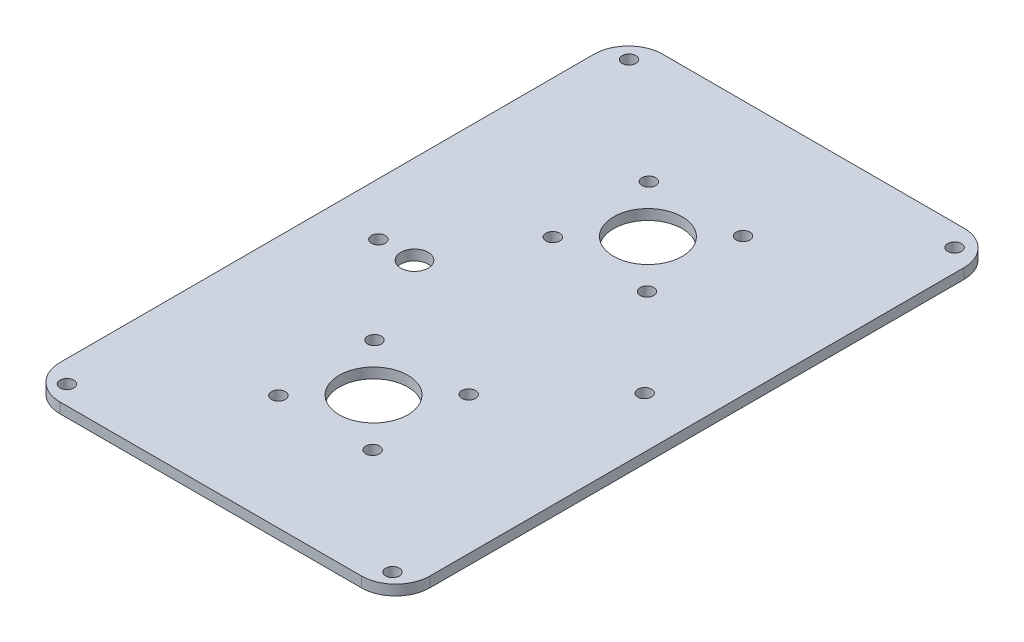
ISO-10303-21;
HEADER;
FILE_DESCRIPTION(('STEP AP214'),'2;1');
FILE_NAME('part.step','',(''),(''),'','','');
FILE_SCHEMA(('AUTOMOTIVE_DESIGN { 1 0 10303 214 1 1 1 1 }'));
ENDSEC;
DATA;
#1=APPLICATION_CONTEXT('core data for automotive mechanical design processes');
#2=APPLICATION_PROTOCOL_DEFINITION('international standard','automotive_design',2000,#1);
#3=PRODUCT_CONTEXT('',#1,'mechanical');
#4=PRODUCT('Part','Part','',(#3));
#5=PRODUCT_RELATED_PRODUCT_CATEGORY('part','',(#4));
#6=PRODUCT_DEFINITION_FORMATION('','',#4);
#7=PRODUCT_DEFINITION_CONTEXT('part definition',#1,'design');
#8=PRODUCT_DEFINITION('design','',#6,#7);
#9=PRODUCT_DEFINITION_SHAPE('','',#8);
#10=(LENGTH_UNIT() NAMED_UNIT(*) SI_UNIT(.MILLI.,.METRE.));
#11=(NAMED_UNIT(*) PLANE_ANGLE_UNIT() SI_UNIT($,.RADIAN.));
#12=(NAMED_UNIT(*) SI_UNIT($,.STERADIAN.) SOLID_ANGLE_UNIT());
#13=UNCERTAINTY_MEASURE_WITH_UNIT(LENGTH_MEASURE(1.E-05),#10,'distance_accuracy_value','');
#14=(GEOMETRIC_REPRESENTATION_CONTEXT(3) GLOBAL_UNCERTAINTY_ASSIGNED_CONTEXT((#13)) GLOBAL_UNIT_ASSIGNED_CONTEXT((#10,
#11,#12)) REPRESENTATION_CONTEXT('',''));
#15=CARTESIAN_POINT('',(0.,0.,0.));
#16=DIRECTION('',(0.,0.,1.));
#17=DIRECTION('',(1.,0.,0.));
#18=AXIS2_PLACEMENT_3D('',#15,#16,#17);
#19=CARTESIAN_POINT('',(-18.9149999999999,3.,-78.1963078680093));
#20=DIRECTION('',(0.,-1.,0.));
#21=DIRECTION('',(0.,0.,-1.));
#22=AXIS2_PLACEMENT_3D('',#19,#20,#21);
#23=CYLINDRICAL_SURFACE('',#22,9.99999999999999);
#24=CARTESIAN_POINT('',(-18.9149999999999,0.,-78.1963078680093));
#25=DIRECTION('',(0.,1.,0.));
#26=DIRECTION('',(0.,0.,1.));
#27=AXIS2_PLACEMENT_3D('',#24,#25,#26);
#28=CIRCLE('',#27,9.99999999999999);
#29=CARTESIAN_POINT('',(-28.9149999999999,0.,-78.1963078680093));
#30=VERTEX_POINT('',#29);
#31=CARTESIAN_POINT('',(-18.9149999999999,0.,-88.1963078680093));
#32=VERTEX_POINT('',#31);
#33=EDGE_CURVE('E186',#30,#32,#28,.F.);
#34=ORIENTED_EDGE('',*,*,#33,.F.);
#35=DIRECTION('',(0.,-1.,0.));
#36=VECTOR('',#35,1.);
#37=CARTESIAN_POINT('',(-28.9149999999999,3.,-78.1963078680093));
#38=LINE('',#37,#36);
#39=CARTESIAN_POINT('',(-28.9149999999999,3.,-78.1963078680093));
#40=VERTEX_POINT('',#39);
#41=EDGE_CURVE('E11',#40,#30,#38,.T.);
#42=ORIENTED_EDGE('',*,*,#41,.F.);
#43=CARTESIAN_POINT('',(-18.9149999999999,3.,-78.1963078680093));
#44=DIRECTION('',(0.,1.,0.));
#45=DIRECTION('',(0.,0.,1.));
#46=AXIS2_PLACEMENT_3D('',#43,#44,#45);
#47=CIRCLE('',#46,9.99999999999999);
#48=CARTESIAN_POINT('',(-18.9149999999999,3.,-88.1963078680093));
#49=VERTEX_POINT('',#48);
#50=EDGE_CURVE('E254',#40,#49,#47,.F.);
#51=ORIENTED_EDGE('',*,*,#50,.T.);
#52=DIRECTION('',(0.,-1.,0.));
#53=VECTOR('',#52,1.);
#54=CARTESIAN_POINT('',(-18.9149999999999,3.,-88.1963078680093));
#55=LINE('',#54,#53);
#56=EDGE_CURVE('E54',#49,#32,#55,.T.);
#57=ORIENTED_EDGE('',*,*,#56,.T.);
#58=EDGE_LOOP('',(#34,#42,#51,#57));
#59=FACE_BOUND('',#58,.T.);
#60=ADVANCED_FACE('F37',(#59),#23,.T.);
#61=CARTESIAN_POINT('',(-28.9149999999999,3.,0.));
#62=DIRECTION('',(1.,0.,0.));
#63=DIRECTION('',(0.,0.,-1.));
#64=AXIS2_PLACEMENT_3D('',#61,#62,#63);
#65=PLANE('',#64);
#66=DIRECTION('',(0.,0.,1.));
#67=VECTOR('',#66,1.);
#68=CARTESIAN_POINT('',(-28.9149999999999,0.,0.));
#69=LINE('',#68,#67);
#70=CARTESIAN_POINT('',(-28.9149999999999,0.,77.4636921319892));
#71=VERTEX_POINT('',#70);
#72=EDGE_CURVE('E188',#30,#71,#69,.T.);
#73=ORIENTED_EDGE('',*,*,#72,.T.);
#74=DIRECTION('',(0.,-1.,0.));
#75=VECTOR('',#74,1.);
#76=CARTESIAN_POINT('',(-28.9149999999999,3.,77.4636921319892));
#77=LINE('',#76,#75);
#78=CARTESIAN_POINT('',(-28.9149999999999,3.,77.4636921319892));
#79=VERTEX_POINT('',#78);
#80=EDGE_CURVE('E46',#79,#71,#77,.T.);
#81=ORIENTED_EDGE('',*,*,#80,.F.);
#82=DIRECTION('',(0.,0.,1.));
#83=VECTOR('',#82,1.);
#84=CARTESIAN_POINT('',(-28.9149999999999,3.,0.));
#85=LINE('',#84,#83);
#86=EDGE_CURVE('E252',#40,#79,#85,.T.);
#87=ORIENTED_EDGE('',*,*,#86,.F.);
#88=ORIENTED_EDGE('',*,*,#41,.T.);
#89=EDGE_LOOP('',(#73,#81,#87,#88));
#90=FACE_BOUND('',#89,.T.);
#91=ADVANCED_FACE('F243',(#90),#65,.F.);
#92=CARTESIAN_POINT('',(-18.9149999999999,3.,77.4636921319892));
#93=DIRECTION('',(0.,-1.,0.));
#94=DIRECTION('',(0.,0.,-1.));
#95=AXIS2_PLACEMENT_3D('',#92,#93,#94);
#96=CYLINDRICAL_SURFACE('',#95,10.);
#97=CARTESIAN_POINT('',(-18.9149999999999,0.,77.4636921319892));
#98=DIRECTION('',(0.,1.,0.));
#99=DIRECTION('',(0.,0.,1.));
#100=AXIS2_PLACEMENT_3D('',#97,#98,#99);
#101=CIRCLE('',#100,10.);
#102=CARTESIAN_POINT('',(-18.9149999999999,0.,87.4636921319892));
#103=VERTEX_POINT('',#102);
#104=EDGE_CURVE('E191',#103,#71,#101,.F.);
#105=ORIENTED_EDGE('',*,*,#104,.F.);
#106=DIRECTION('',(0.,-1.,0.));
#107=VECTOR('',#106,1.);
#108=CARTESIAN_POINT('',(-18.9149999999999,3.,87.4636921319892));
#109=LINE('',#108,#107);
#110=CARTESIAN_POINT('',(-18.9149999999999,3.,87.4636921319892));
#111=VERTEX_POINT('',#110);
#112=EDGE_CURVE('E233',#111,#103,#109,.T.);
#113=ORIENTED_EDGE('',*,*,#112,.F.);
#114=CARTESIAN_POINT('',(-18.9149999999999,3.,77.4636921319892));
#115=DIRECTION('',(0.,1.,0.));
#116=DIRECTION('',(0.,0.,1.));
#117=AXIS2_PLACEMENT_3D('',#114,#115,#116);
#118=CIRCLE('',#117,10.);
#119=EDGE_CURVE('E240',#111,#79,#118,.F.);
#120=ORIENTED_EDGE('',*,*,#119,.T.);
#121=ORIENTED_EDGE('',*,*,#80,.T.);
#122=EDGE_LOOP('',(#105,#113,#120,#121));
#123=FACE_BOUND('',#122,.T.);
#124=ADVANCED_FACE('F238',(#123),#96,.T.);
#125=CARTESIAN_POINT('',(0.,3.,87.4636921319892));
#126=DIRECTION('',(0.,0.,1.));
#127=DIRECTION('',(1.,0.,0.));
#128=AXIS2_PLACEMENT_3D('',#125,#126,#127);
#129=PLANE('',#128);
#130=DIRECTION('',(-1.,0.,0.));
#131=VECTOR('',#130,1.);
#132=CARTESIAN_POINT('',(0.,0.,87.4636921319892));
#133=LINE('',#132,#131);
#134=CARTESIAN_POINT('',(68.9150000000001,0.,87.4636921319892));
#135=VERTEX_POINT('',#134);
#136=EDGE_CURVE('E194',#135,#103,#133,.T.);
#137=ORIENTED_EDGE('',*,*,#136,.F.);
#138=DIRECTION('',(0.,-1.,0.));
#139=VECTOR('',#138,1.);
#140=CARTESIAN_POINT('',(68.9150000000001,3.,87.4636921319892));
#141=LINE('',#140,#139);
#142=CARTESIAN_POINT('',(68.9150000000001,3.,87.4636921319892));
#143=VERTEX_POINT('',#142);
#144=EDGE_CURVE('E231',#143,#135,#141,.T.);
#145=ORIENTED_EDGE('',*,*,#144,.F.);
#146=DIRECTION('',(-1.,0.,0.));
#147=VECTOR('',#146,1.);
#148=CARTESIAN_POINT('',(0.,3.,87.4636921319892));
#149=LINE('',#148,#147);
#150=EDGE_CURVE('E130',#143,#111,#149,.T.);
#151=ORIENTED_EDGE('',*,*,#150,.T.);
#152=ORIENTED_EDGE('',*,*,#112,.T.);
#153=EDGE_LOOP('',(#137,#145,#151,#152));
#154=FACE_BOUND('',#153,.T.);
#155=ADVANCED_FACE('F250',(#154),#129,.T.);
#156=CARTESIAN_POINT('',(68.9150000000001,3.,77.4636921319892));
#157=DIRECTION('',(0.,-1.,0.));
#158=DIRECTION('',(0.,0.,-1.));
#159=AXIS2_PLACEMENT_3D('',#156,#157,#158);
#160=CYLINDRICAL_SURFACE('',#159,10.);
#161=CARTESIAN_POINT('',(68.9150000000001,0.,77.4636921319892));
#162=DIRECTION('',(0.,1.,0.));
#163=DIRECTION('',(0.,0.,1.));
#164=AXIS2_PLACEMENT_3D('',#161,#162,#163);
#165=CIRCLE('',#164,10.);
#166=CARTESIAN_POINT('',(78.9150000000001,0.,77.4636921319892));
#167=VERTEX_POINT('',#166);
#168=EDGE_CURVE('E197',#135,#167,#165,.T.);
#169=ORIENTED_EDGE('',*,*,#168,.T.);
#170=DIRECTION('',(0.,-1.,0.));
#171=VECTOR('',#170,1.);
#172=CARTESIAN_POINT('',(78.9150000000001,3.,77.4636921319892));
#173=LINE('',#172,#171);
#174=CARTESIAN_POINT('',(78.9150000000001,3.,77.4636921319892));
#175=VERTEX_POINT('',#174);
#176=EDGE_CURVE('E114',#175,#167,#173,.T.);
#177=ORIENTED_EDGE('',*,*,#176,.F.);
#178=CARTESIAN_POINT('',(68.9150000000001,3.,77.4636921319892));
#179=DIRECTION('',(0.,1.,0.));
#180=DIRECTION('',(0.,0.,1.));
#181=AXIS2_PLACEMENT_3D('',#178,#179,#180);
#182=CIRCLE('',#181,10.);
#183=EDGE_CURVE('E127',#143,#175,#182,.T.);
#184=ORIENTED_EDGE('',*,*,#183,.F.);
#185=ORIENTED_EDGE('',*,*,#144,.T.);
#186=EDGE_LOOP('',(#169,#177,#184,#185));
#187=FACE_BOUND('',#186,.T.);
#188=ADVANCED_FACE('F429',(#187),#160,.T.);
#189=CARTESIAN_POINT('',(78.9150000000001,3.,0.));
#190=DIRECTION('',(1.,0.,0.));
#191=DIRECTION('',(0.,0.,-1.));
#192=AXIS2_PLACEMENT_3D('',#189,#190,#191);
#193=PLANE('',#192);
#194=DIRECTION('',(0.,0.,1.));
#195=VECTOR('',#194,1.);
#196=CARTESIAN_POINT('',(78.9150000000001,0.,0.));
#197=LINE('',#196,#195);
#198=CARTESIAN_POINT('',(78.9150000000001,0.,-78.1963078680093));
#199=VERTEX_POINT('',#198);
#200=EDGE_CURVE('E111',#199,#167,#197,.T.);
#201=ORIENTED_EDGE('',*,*,#200,.F.);
#202=DIRECTION('',(0.,-1.,0.));
#203=VECTOR('',#202,1.);
#204=CARTESIAN_POINT('',(78.9150000000001,3.,-78.1963078680093));
#205=LINE('',#204,#203);
#206=CARTESIAN_POINT('',(78.9150000000001,3.,-78.1963078680093));
#207=VERTEX_POINT('',#206);
#208=EDGE_CURVE('E105',#207,#199,#205,.T.);
#209=ORIENTED_EDGE('',*,*,#208,.F.);
#210=DIRECTION('',(0.,0.,1.));
#211=VECTOR('',#210,1.);
#212=CARTESIAN_POINT('',(78.9150000000001,3.,0.));
#213=LINE('',#212,#211);
#214=EDGE_CURVE('E109',#207,#175,#213,.T.);
#215=ORIENTED_EDGE('',*,*,#214,.T.);
#216=ORIENTED_EDGE('',*,*,#176,.T.);
#217=EDGE_LOOP('',(#201,#209,#215,#216));
#218=FACE_BOUND('',#217,.T.);
#219=ADVANCED_FACE('F107',(#218),#193,.T.);
#220=CARTESIAN_POINT('',(68.9150000000001,3.,-78.1963078680093));
#221=DIRECTION('',(0.,-1.,0.));
#222=DIRECTION('',(0.,0.,-1.));
#223=AXIS2_PLACEMENT_3D('',#220,#221,#222);
#224=CYLINDRICAL_SURFACE('',#223,10.);
#225=CARTESIAN_POINT('',(68.9150000000001,0.,-78.1963078680093));
#226=DIRECTION('',(0.,1.,0.));
#227=DIRECTION('',(0.,0.,1.));
#228=AXIS2_PLACEMENT_3D('',#225,#226,#227);
#229=CIRCLE('',#228,10.);
#230=CARTESIAN_POINT('',(68.9150000000001,0.,-88.1963078680093));
#231=VERTEX_POINT('',#230);
#232=EDGE_CURVE('E201',#199,#231,#229,.T.);
#233=ORIENTED_EDGE('',*,*,#232,.T.);
#234=DIRECTION('',(0.,-1.,0.));
#235=VECTOR('',#234,1.);
#236=CARTESIAN_POINT('',(68.9150000000001,3.,-88.1963078680093));
#237=LINE('',#236,#235);
#238=CARTESIAN_POINT('',(68.9150000000001,3.,-88.1963078680093));
#239=VERTEX_POINT('',#238);
#240=EDGE_CURVE('E80',#239,#231,#237,.T.);
#241=ORIENTED_EDGE('',*,*,#240,.F.);
#242=CARTESIAN_POINT('',(68.9150000000001,3.,-78.1963078680093));
#243=DIRECTION('',(0.,1.,0.));
#244=DIRECTION('',(0.,0.,1.));
#245=AXIS2_PLACEMENT_3D('',#242,#243,#244);
#246=CIRCLE('',#245,10.);
#247=EDGE_CURVE('E116',#207,#239,#246,.T.);
#248=ORIENTED_EDGE('',*,*,#247,.F.);
#249=ORIENTED_EDGE('',*,*,#208,.T.);
#250=EDGE_LOOP('',(#233,#241,#248,#249));
#251=FACE_BOUND('',#250,.T.);
#252=ADVANCED_FACE('F117',(#251),#224,.T.);
#253=CARTESIAN_POINT('',(11.2670350896735,3.,-26.));
#254=DIRECTION('',(0.,-1.,0.));
#255=DIRECTION('',(0.,0.,-1.));
#256=AXIS2_PLACEMENT_3D('',#253,#254,#255);
#257=CYLINDRICAL_SURFACE('',#256,2.);
#258=CARTESIAN_POINT('',(11.2670350896735,3.,-26.));
#259=DIRECTION('',(0.,1.,0.));
#260=DIRECTION('',(0.,0.,1.));
#261=AXIS2_PLACEMENT_3D('',#258,#259,#260);
#262=CIRCLE('',#261,2.);
#263=CARTESIAN_POINT('',(11.2670350896735,3.,-24.));
#264=VERTEX_POINT('',#263);
#265=EDGE_CURVE('E150',#264,#264,#262,.F.);
#266=ORIENTED_EDGE('',*,*,#265,.F.);
#267=EDGE_LOOP('',(#266));
#268=FACE_BOUND('',#267,.T.);
#269=CARTESIAN_POINT('',(11.2670350896735,0.,-26.));
#270=DIRECTION('',(0.,1.,0.));
#271=DIRECTION('',(0.,0.,1.));
#272=AXIS2_PLACEMENT_3D('',#269,#270,#271);
#273=CIRCLE('',#272,2.);
#274=CARTESIAN_POINT('',(11.2670350896735,0.,-24.));
#275=VERTEX_POINT('',#274);
#276=EDGE_CURVE('E221',#275,#275,#273,.F.);
#277=ORIENTED_EDGE('',*,*,#276,.T.);
#278=EDGE_LOOP('',(#277));
#279=FACE_BOUND('',#278,.T.);
#280=ADVANCED_FACE('F399',(#268,#279),#257,.F.);
#281=CARTESIAN_POINT('',(38.7329649103267,3.,-26.));
#282=DIRECTION('',(0.,-1.,0.));
#283=DIRECTION('',(0.,0.,-1.));
#284=AXIS2_PLACEMENT_3D('',#281,#282,#283);
#285=CYLINDRICAL_SURFACE('',#284,2.);
#286=CARTESIAN_POINT('',(38.7329649103267,3.,-26.));
#287=DIRECTION('',(0.,1.,0.));
#288=DIRECTION('',(0.,0.,1.));
#289=AXIS2_PLACEMENT_3D('',#286,#287,#288);
#290=CIRCLE('',#289,2.);
#291=CARTESIAN_POINT('',(38.7329649103267,3.,-24.));
#292=VERTEX_POINT('',#291);
#293=EDGE_CURVE('E147',#292,#292,#290,.T.);
#294=ORIENTED_EDGE('',*,*,#293,.T.);
#295=EDGE_LOOP('',(#294));
#296=FACE_BOUND('',#295,.T.);
#297=CARTESIAN_POINT('',(38.7329649103267,0.,-26.));
#298=DIRECTION('',(0.,1.,0.));
#299=DIRECTION('',(0.,0.,1.));
#300=AXIS2_PLACEMENT_3D('',#297,#298,#299);
#301=CIRCLE('',#300,2.);
#302=CARTESIAN_POINT('',(38.7329649103267,0.,-24.));
#303=VERTEX_POINT('',#302);
#304=EDGE_CURVE('E218',#303,#303,#301,.T.);
#305=ORIENTED_EDGE('',*,*,#304,.F.);
#306=EDGE_LOOP('',(#305));
#307=FACE_BOUND('',#306,.T.);
#308=ADVANCED_FACE('F402',(#296,#307),#285,.F.);
#309=CARTESIAN_POINT('',(-22.4649999999998,3.,-81.9363078680093));
#310=DIRECTION('',(0.,-1.,0.));
#311=DIRECTION('',(0.,0.,-1.));
#312=AXIS2_PLACEMENT_3D('',#309,#310,#311);
#313=CYLINDRICAL_SURFACE('',#312,2.00000000000001);
#314=CARTESIAN_POINT('',(-22.4649999999998,3.,-81.9363078680093));
#315=DIRECTION('',(0.,1.,0.));
#316=DIRECTION('',(0.,0.,1.));
#317=AXIS2_PLACEMENT_3D('',#314,#315,#316);
#318=CIRCLE('',#317,2.00000000000001);
#319=CARTESIAN_POINT('',(-22.4649999999998,3.,-79.9363078680093));
#320=VERTEX_POINT('',#319);
#321=EDGE_CURVE('E144',#320,#320,#318,.F.);
#322=ORIENTED_EDGE('',*,*,#321,.F.);
#323=EDGE_LOOP('',(#322));
#324=FACE_BOUND('',#323,.T.);
#325=CARTESIAN_POINT('',(-22.4649999999998,0.,-81.9363078680093));
#326=DIRECTION('',(0.,1.,0.));
#327=DIRECTION('',(0.,0.,1.));
#328=AXIS2_PLACEMENT_3D('',#325,#326,#327);
#329=CIRCLE('',#328,2.00000000000001);
#330=CARTESIAN_POINT('',(-22.4649999999998,0.,-79.9363078680093));
#331=VERTEX_POINT('',#330);
#332=EDGE_CURVE('E215',#331,#331,#329,.F.);
#333=ORIENTED_EDGE('',*,*,#332,.T.);
#334=EDGE_LOOP('',(#333));
#335=FACE_BOUND('',#334,.T.);
#336=ADVANCED_FACE('F406',(#324,#335),#313,.F.);
#337=CARTESIAN_POINT('',(-22.4649999999998,3.,81.9363078680093));
#338=DIRECTION('',(0.,-1.,0.));
#339=DIRECTION('',(0.,0.,-1.));
#340=AXIS2_PLACEMENT_3D('',#337,#338,#339);
#341=CYLINDRICAL_SURFACE('',#340,2.00000000000006);
#342=CARTESIAN_POINT('',(-22.4649999999998,3.,81.9363078680093));
#343=DIRECTION('',(0.,1.,0.));
#344=DIRECTION('',(0.,0.,1.));
#345=AXIS2_PLACEMENT_3D('',#342,#343,#344);
#346=CIRCLE('',#345,2.00000000000006);
#347=CARTESIAN_POINT('',(-22.4649999999998,3.,83.9363078680094));
#348=VERTEX_POINT('',#347);
#349=EDGE_CURVE('E141',#348,#348,#346,.T.);
#350=ORIENTED_EDGE('',*,*,#349,.T.);
#351=EDGE_LOOP('',(#350));
#352=FACE_BOUND('',#351,.T.);
#353=CARTESIAN_POINT('',(-22.4649999999998,0.,81.9363078680093));
#354=DIRECTION('',(0.,1.,0.));
#355=DIRECTION('',(0.,0.,1.));
#356=AXIS2_PLACEMENT_3D('',#353,#354,#355);
#357=CIRCLE('',#356,2.00000000000006);
#358=CARTESIAN_POINT('',(-22.4649999999998,0.,83.9363078680094));
#359=VERTEX_POINT('',#358);
#360=EDGE_CURVE('E212',#359,#359,#357,.T.);
#361=ORIENTED_EDGE('',*,*,#360,.F.);
#362=EDGE_LOOP('',(#361));
#363=FACE_BOUND('',#362,.T.);
#364=ADVANCED_FACE('F410',(#352,#363),#341,.F.);
#365=CARTESIAN_POINT('',(72.4650000000001,3.,-81.9363078680093));
#366=DIRECTION('',(0.,-1.,0.));
#367=DIRECTION('',(0.,0.,-1.));
#368=AXIS2_PLACEMENT_3D('',#365,#366,#367);
#369=CYLINDRICAL_SURFACE('',#368,2.);
#370=CARTESIAN_POINT('',(72.4650000000001,3.,-81.9363078680093));
#371=DIRECTION('',(0.,1.,0.));
#372=DIRECTION('',(0.,0.,1.));
#373=AXIS2_PLACEMENT_3D('',#370,#371,#372);
#374=CIRCLE('',#373,2.);
#375=CARTESIAN_POINT('',(72.4650000000001,3.,-79.9363078680093));
#376=VERTEX_POINT('',#375);
#377=EDGE_CURVE('E138',#376,#376,#374,.T.);
#378=ORIENTED_EDGE('',*,*,#377,.T.);
#379=EDGE_LOOP('',(#378));
#380=FACE_BOUND('',#379,.T.);
#381=CARTESIAN_POINT('',(72.4650000000001,0.,-81.9363078680093));
#382=DIRECTION('',(0.,1.,0.));
#383=DIRECTION('',(0.,0.,1.));
#384=AXIS2_PLACEMENT_3D('',#381,#382,#383);
#385=CIRCLE('',#384,2.);
#386=CARTESIAN_POINT('',(72.4650000000001,0.,-79.9363078680093));
#387=VERTEX_POINT('',#386);
#388=EDGE_CURVE('E209',#387,#387,#385,.T.);
#389=ORIENTED_EDGE('',*,*,#388,.F.);
#390=EDGE_LOOP('',(#389));
#391=FACE_BOUND('',#390,.T.);
#392=ADVANCED_FACE('F414',(#380,#391),#369,.F.);
#393=CARTESIAN_POINT('',(72.4650000000001,3.,81.9363078680093));
#394=DIRECTION('',(0.,-1.,0.));
#395=DIRECTION('',(0.,0.,-1.));
#396=AXIS2_PLACEMENT_3D('',#393,#394,#395);
#397=CYLINDRICAL_SURFACE('',#396,2.);
#398=CARTESIAN_POINT('',(72.4650000000001,3.,81.9363078680093));
#399=DIRECTION('',(0.,1.,0.));
#400=DIRECTION('',(0.,0.,1.));
#401=AXIS2_PLACEMENT_3D('',#398,#399,#400);
#402=CIRCLE('',#401,2.);
#403=CARTESIAN_POINT('',(72.4650000000001,3.,83.9363078680093));
#404=VERTEX_POINT('',#403);
#405=EDGE_CURVE('E135',#404,#404,#402,.F.);
#406=ORIENTED_EDGE('',*,*,#405,.F.);
#407=EDGE_LOOP('',(#406));
#408=FACE_BOUND('',#407,.T.);
#409=CARTESIAN_POINT('',(72.4650000000001,0.,81.9363078680093));
#410=DIRECTION('',(0.,1.,0.));
#411=DIRECTION('',(0.,0.,1.));
#412=AXIS2_PLACEMENT_3D('',#409,#410,#411);
#413=CIRCLE('',#412,2.);
#414=CARTESIAN_POINT('',(72.4650000000001,0.,83.9363078680093));
#415=VERTEX_POINT('',#414);
#416=EDGE_CURVE('E206',#415,#415,#413,.F.);
#417=ORIENTED_EDGE('',*,*,#416,.T.);
#418=EDGE_LOOP('',(#417));
#419=FACE_BOUND('',#418,.T.);
#420=ADVANCED_FACE('F418',(#408,#419),#397,.F.);
#421=CARTESIAN_POINT('',(0.,3.,-88.1963078680093));
#422=DIRECTION('',(0.,0.,-1.));
#423=DIRECTION('',(-1.,0.,0.));
#424=AXIS2_PLACEMENT_3D('',#421,#422,#423);
#425=PLANE('',#424);
#426=DIRECTION('',(1.,0.,0.));
#427=VECTOR('',#426,1.);
#428=CARTESIAN_POINT('',(0.,0.,-88.1963078680093));
#429=LINE('',#428,#427);
#430=EDGE_CURVE('E203',#32,#231,#429,.T.);
#431=ORIENTED_EDGE('',*,*,#430,.F.);
#432=ORIENTED_EDGE('',*,*,#56,.F.);
#433=DIRECTION('',(1.,0.,0.));
#434=VECTOR('',#433,1.);
#435=CARTESIAN_POINT('',(0.,3.,-88.1963078680093));
#436=LINE('',#435,#434);
#437=EDGE_CURVE('E120',#49,#239,#436,.T.);
#438=ORIENTED_EDGE('',*,*,#437,.T.);
#439=ORIENTED_EDGE('',*,*,#240,.T.);
#440=EDGE_LOOP('',(#431,#432,#438,#439));
#441=FACE_BOUND('',#440,.T.);
#442=ADVANCED_FACE('F316',(#441),#425,.T.);
#443=CARTESIAN_POINT('',(11.2670350896735,3.,-54.));
#444=DIRECTION('',(0.,-1.,0.));
#445=DIRECTION('',(0.,0.,-1.));
#446=AXIS2_PLACEMENT_3D('',#443,#444,#445);
#447=CYLINDRICAL_SURFACE('',#446,2.);
#448=CARTESIAN_POINT('',(11.2670350896735,3.,-54.));
#449=DIRECTION('',(0.,1.,0.));
#450=DIRECTION('',(0.,0.,1.));
#451=AXIS2_PLACEMENT_3D('',#448,#449,#450);
#452=CIRCLE('',#451,2.);
#453=CARTESIAN_POINT('',(11.2670350896735,3.,-52.));
#454=VERTEX_POINT('',#453);
#455=EDGE_CURVE('E258',#454,#454,#452,.T.);
#456=ORIENTED_EDGE('',*,*,#455,.T.);
#457=EDGE_LOOP('',(#456));
#458=FACE_BOUND('',#457,.T.);
#459=CARTESIAN_POINT('',(11.2670350896735,0.,-54.));
#460=DIRECTION('',(0.,1.,0.));
#461=DIRECTION('',(0.,0.,1.));
#462=AXIS2_PLACEMENT_3D('',#459,#460,#461);
#463=CIRCLE('',#462,2.);
#464=CARTESIAN_POINT('',(11.2670350896735,0.,-52.));
#465=VERTEX_POINT('',#464);
#466=EDGE_CURVE('E183',#465,#465,#463,.T.);
#467=ORIENTED_EDGE('',*,*,#466,.F.);
#468=EDGE_LOOP('',(#467));
#469=FACE_BOUND('',#468,.T.);
#470=ADVANCED_FACE('F312',(#458,#469),#447,.F.);
#471=CARTESIAN_POINT('',(38.7329649103267,3.,-54.));
#472=DIRECTION('',(0.,-1.,0.));
#473=DIRECTION('',(0.,0.,-1.));
#474=AXIS2_PLACEMENT_3D('',#471,#472,#473);
#475=CYLINDRICAL_SURFACE('',#474,2.);
#476=CARTESIAN_POINT('',(38.7329649103267,3.,-54.));
#477=DIRECTION('',(0.,1.,0.));
#478=DIRECTION('',(0.,0.,1.));
#479=AXIS2_PLACEMENT_3D('',#476,#477,#478);
#480=CIRCLE('',#479,2.);
#481=CARTESIAN_POINT('',(38.7329649103267,3.,-52.));
#482=VERTEX_POINT('',#481);
#483=EDGE_CURVE('E261',#482,#482,#480,.F.);
#484=ORIENTED_EDGE('',*,*,#483,.F.);
#485=EDGE_LOOP('',(#484));
#486=FACE_BOUND('',#485,.T.);
#487=CARTESIAN_POINT('',(38.7329649103267,0.,-54.));
#488=DIRECTION('',(0.,1.,0.));
#489=DIRECTION('',(0.,0.,1.));
#490=AXIS2_PLACEMENT_3D('',#487,#488,#489);
#491=CIRCLE('',#490,2.);
#492=CARTESIAN_POINT('',(38.7329649103267,0.,-52.));
#493=VERTEX_POINT('',#492);
#494=EDGE_CURVE('E180',#493,#493,#491,.F.);
#495=ORIENTED_EDGE('',*,*,#494,.T.);
#496=EDGE_LOOP('',(#495));
#497=FACE_BOUND('',#496,.T.);
#498=ADVANCED_FACE('F315',(#486,#497),#475,.F.);
#499=CARTESIAN_POINT('',(11.2670350896735,3.,26.));
#500=DIRECTION('',(0.,-1.,0.));
#501=DIRECTION('',(0.,0.,-1.));
#502=AXIS2_PLACEMENT_3D('',#499,#500,#501);
#503=CYLINDRICAL_SURFACE('',#502,2.);
#504=CARTESIAN_POINT('',(11.2670350896735,3.,26.));
#505=DIRECTION('',(0.,1.,0.));
#506=DIRECTION('',(0.,0.,1.));
#507=AXIS2_PLACEMENT_3D('',#504,#505,#506);
#508=CIRCLE('',#507,2.);
#509=CARTESIAN_POINT('',(11.2670350896735,3.,28.));
#510=VERTEX_POINT('',#509);
#511=EDGE_CURVE('E264',#510,#510,#508,.T.);
#512=ORIENTED_EDGE('',*,*,#511,.T.);
#513=EDGE_LOOP('',(#512));
#514=FACE_BOUND('',#513,.T.);
#515=CARTESIAN_POINT('',(11.2670350896735,0.,26.));
#516=DIRECTION('',(0.,1.,0.));
#517=DIRECTION('',(0.,0.,1.));
#518=AXIS2_PLACEMENT_3D('',#515,#516,#517);
#519=CIRCLE('',#518,2.);
#520=CARTESIAN_POINT('',(11.2670350896735,0.,28.));
#521=VERTEX_POINT('',#520);
#522=EDGE_CURVE('E177',#521,#521,#519,.T.);
#523=ORIENTED_EDGE('',*,*,#522,.F.);
#524=EDGE_LOOP('',(#523));
#525=FACE_BOUND('',#524,.T.);
#526=ADVANCED_FACE('F337',(#514,#525),#503,.F.);
#527=CARTESIAN_POINT('',(11.2670350896735,3.,54.));
#528=DIRECTION('',(0.,-1.,0.));
#529=DIRECTION('',(0.,0.,-1.));
#530=AXIS2_PLACEMENT_3D('',#527,#528,#529);
#531=CYLINDRICAL_SURFACE('',#530,2.);
#532=CARTESIAN_POINT('',(11.2670350896735,3.,54.));
#533=DIRECTION('',(0.,1.,0.));
#534=DIRECTION('',(0.,0.,1.));
#535=AXIS2_PLACEMENT_3D('',#532,#533,#534);
#536=CIRCLE('',#535,2.);
#537=CARTESIAN_POINT('',(11.2670350896735,3.,56.));
#538=VERTEX_POINT('',#537);
#539=EDGE_CURVE('E267',#538,#538,#536,.F.);
#540=ORIENTED_EDGE('',*,*,#539,.F.);
#541=EDGE_LOOP('',(#540));
#542=FACE_BOUND('',#541,.T.);
#543=CARTESIAN_POINT('',(11.2670350896735,0.,54.));
#544=DIRECTION('',(0.,1.,0.));
#545=DIRECTION('',(0.,0.,1.));
#546=AXIS2_PLACEMENT_3D('',#543,#544,#545);
#547=CIRCLE('',#546,2.);
#548=CARTESIAN_POINT('',(11.2670350896735,0.,56.));
#549=VERTEX_POINT('',#548);
#550=EDGE_CURVE('E174',#549,#549,#547,.F.);
#551=ORIENTED_EDGE('',*,*,#550,.T.);
#552=EDGE_LOOP('',(#551));
#553=FACE_BOUND('',#552,.T.);
#554=ADVANCED_FACE('F341',(#542,#553),#531,.F.);
#555=CARTESIAN_POINT('',(25.0000000000001,3.,40.));
#556=DIRECTION('',(0.,-1.,0.));
#557=DIRECTION('',(0.,0.,-1.));
#558=AXIS2_PLACEMENT_3D('',#555,#556,#557);
#559=CYLINDRICAL_SURFACE('',#558,9.99999999999999);
#560=CARTESIAN_POINT('',(25.0000000000001,3.,40.));
#561=DIRECTION('',(0.,1.,0.));
#562=DIRECTION('',(0.,0.,1.));
#563=AXIS2_PLACEMENT_3D('',#560,#561,#562);
#564=CIRCLE('',#563,9.99999999999999);
#565=CARTESIAN_POINT('',(25.0000000000001,3.,50.));
#566=VERTEX_POINT('',#565);
#567=EDGE_CURVE('E270',#566,#566,#564,.F.);
#568=ORIENTED_EDGE('',*,*,#567,.F.);
#569=EDGE_LOOP('',(#568));
#570=FACE_BOUND('',#569,.T.);
#571=CARTESIAN_POINT('',(25.0000000000001,0.,40.));
#572=DIRECTION('',(0.,1.,0.));
#573=DIRECTION('',(0.,0.,1.));
#574=AXIS2_PLACEMENT_3D('',#571,#572,#573);
#575=CIRCLE('',#574,9.99999999999999);
#576=CARTESIAN_POINT('',(25.0000000000001,0.,50.));
#577=VERTEX_POINT('',#576);
#578=EDGE_CURVE('E171',#577,#577,#575,.F.);
#579=ORIENTED_EDGE('',*,*,#578,.T.);
#580=EDGE_LOOP('',(#579));
#581=FACE_BOUND('',#580,.T.);
#582=ADVANCED_FACE('F345',(#570,#581),#559,.F.);
#583=CARTESIAN_POINT('',(38.7329649103267,3.,54.));
#584=DIRECTION('',(0.,-1.,0.));
#585=DIRECTION('',(0.,0.,-1.));
#586=AXIS2_PLACEMENT_3D('',#583,#584,#585);
#587=CYLINDRICAL_SURFACE('',#586,2.);
#588=CARTESIAN_POINT('',(38.7329649103267,3.,54.));
#589=DIRECTION('',(0.,1.,0.));
#590=DIRECTION('',(0.,0.,1.));
#591=AXIS2_PLACEMENT_3D('',#588,#589,#590);
#592=CIRCLE('',#591,2.);
#593=CARTESIAN_POINT('',(38.7329649103267,3.,56.));
#594=VERTEX_POINT('',#593);
#595=EDGE_CURVE('E273',#594,#594,#592,.T.);
#596=ORIENTED_EDGE('',*,*,#595,.T.);
#597=EDGE_LOOP('',(#596));
#598=FACE_BOUND('',#597,.T.);
#599=CARTESIAN_POINT('',(38.7329649103267,0.,54.));
#600=DIRECTION('',(0.,1.,0.));
#601=DIRECTION('',(0.,0.,1.));
#602=AXIS2_PLACEMENT_3D('',#599,#600,#601);
#603=CIRCLE('',#602,2.);
#604=CARTESIAN_POINT('',(38.7329649103267,0.,56.));
#605=VERTEX_POINT('',#604);
#606=EDGE_CURVE('E168',#605,#605,#603,.T.);
#607=ORIENTED_EDGE('',*,*,#606,.F.);
#608=EDGE_LOOP('',(#607));
#609=FACE_BOUND('',#608,.T.);
#610=ADVANCED_FACE('F349',(#598,#609),#587,.F.);
#611=CARTESIAN_POINT('',(64.0517310171437,3.,0.00615374266407787));
#612=DIRECTION('',(0.,-1.,0.));
#613=DIRECTION('',(0.,0.,-1.));
#614=AXIS2_PLACEMENT_3D('',#611,#612,#613);
#615=CYLINDRICAL_SURFACE('',#614,2.);
#616=CARTESIAN_POINT('',(64.0517310171437,3.,0.00615374266407787));
#617=DIRECTION('',(0.,1.,0.));
#618=DIRECTION('',(0.,0.,1.));
#619=AXIS2_PLACEMENT_3D('',#616,#617,#618);
#620=CIRCLE('',#619,2.);
#621=CARTESIAN_POINT('',(64.0517310171437,3.,2.00615374266407));
#622=VERTEX_POINT('',#621);
#623=EDGE_CURVE('E276',#622,#622,#620,.T.);
#624=ORIENTED_EDGE('',*,*,#623,.T.);
#625=EDGE_LOOP('',(#624));
#626=FACE_BOUND('',#625,.T.);
#627=CARTESIAN_POINT('',(64.0517310171437,0.,0.00615374266407787));
#628=DIRECTION('',(0.,1.,0.));
#629=DIRECTION('',(0.,0.,1.));
#630=AXIS2_PLACEMENT_3D('',#627,#628,#629);
#631=CIRCLE('',#630,2.);
#632=CARTESIAN_POINT('',(64.0517310171437,0.,2.00615374266407));
#633=VERTEX_POINT('',#632);
#634=EDGE_CURVE('E165',#633,#633,#631,.T.);
#635=ORIENTED_EDGE('',*,*,#634,.F.);
#636=EDGE_LOOP('',(#635));
#637=FACE_BOUND('',#636,.T.);
#638=ADVANCED_FACE('F353',(#626,#637),#615,.F.);
#639=CARTESIAN_POINT('',(-3.06479997124239,3.,0.00615374266407787));
#640=DIRECTION('',(0.,-1.,0.));
#641=DIRECTION('',(0.,0.,-1.));
#642=AXIS2_PLACEMENT_3D('',#639,#640,#641);
#643=CYLINDRICAL_SURFACE('',#642,4.);
#644=CARTESIAN_POINT('',(-3.06479997124239,3.,0.00615374266407787));
#645=DIRECTION('',(0.,1.,0.));
#646=DIRECTION('',(0.,0.,1.));
#647=AXIS2_PLACEMENT_3D('',#644,#645,#646);
#648=CIRCLE('',#647,4.);
#649=CARTESIAN_POINT('',(-3.06479997124239,3.,4.00615374266408));
#650=VERTEX_POINT('',#649);
#651=EDGE_CURVE('E279',#650,#650,#648,.T.);
#652=ORIENTED_EDGE('',*,*,#651,.T.);
#653=EDGE_LOOP('',(#652));
#654=FACE_BOUND('',#653,.T.);
#655=CARTESIAN_POINT('',(-3.06479997124239,0.,0.00615374266407787));
#656=DIRECTION('',(0.,1.,0.));
#657=DIRECTION('',(0.,0.,1.));
#658=AXIS2_PLACEMENT_3D('',#655,#656,#657);
#659=CIRCLE('',#658,4.);
#660=CARTESIAN_POINT('',(-3.06479997124239,0.,4.00615374266408));
#661=VERTEX_POINT('',#660);
#662=EDGE_CURVE('E162',#661,#661,#659,.T.);
#663=ORIENTED_EDGE('',*,*,#662,.F.);
#664=EDGE_LOOP('',(#663));
#665=FACE_BOUND('',#664,.T.);
#666=ADVANCED_FACE('F357',(#654,#665),#643,.F.);
#667=CARTESIAN_POINT('',(-13.6008680829438,3.,0.00615374266429991));
#668=DIRECTION('',(0.,-1.,0.));
#669=DIRECTION('',(0.,0.,-1.));
#670=AXIS2_PLACEMENT_3D('',#667,#668,#669);
#671=CYLINDRICAL_SURFACE('',#670,2.00000000000001);
#672=CARTESIAN_POINT('',(-13.6008680829438,3.,0.00615374266429991));
#673=DIRECTION('',(0.,1.,0.));
#674=DIRECTION('',(0.,0.,1.));
#675=AXIS2_PLACEMENT_3D('',#672,#673,#674);
#676=CIRCLE('',#675,2.00000000000001);
#677=CARTESIAN_POINT('',(-13.6008680829438,3.,2.00615374266431));
#678=VERTEX_POINT('',#677);
#679=EDGE_CURVE('E282',#678,#678,#676,.T.);
#680=ORIENTED_EDGE('',*,*,#679,.T.);
#681=EDGE_LOOP('',(#680));
#682=FACE_BOUND('',#681,.T.);
#683=CARTESIAN_POINT('',(-13.6008680829438,0.,0.00615374266429991));
#684=DIRECTION('',(0.,1.,0.));
#685=DIRECTION('',(0.,0.,1.));
#686=AXIS2_PLACEMENT_3D('',#683,#684,#685);
#687=CIRCLE('',#686,2.00000000000001);
#688=CARTESIAN_POINT('',(-13.6008680829438,0.,2.00615374266431));
#689=VERTEX_POINT('',#688);
#690=EDGE_CURVE('E159',#689,#689,#687,.T.);
#691=ORIENTED_EDGE('',*,*,#690,.F.);
#692=EDGE_LOOP('',(#691));
#693=FACE_BOUND('',#692,.T.);
#694=ADVANCED_FACE('F360',(#682,#693),#671,.F.);
#695=CARTESIAN_POINT('',(25.0000000000001,3.,-40.));
#696=DIRECTION('',(0.,-1.,0.));
#697=DIRECTION('',(0.,0.,-1.));
#698=AXIS2_PLACEMENT_3D('',#695,#696,#697);
#699=CYLINDRICAL_SURFACE('',#698,10.);
#700=CARTESIAN_POINT('',(25.0000000000001,3.,-40.));
#701=DIRECTION('',(0.,1.,0.));
#702=DIRECTION('',(0.,0.,1.));
#703=AXIS2_PLACEMENT_3D('',#700,#701,#702);
#704=CIRCLE('',#703,10.);
#705=CARTESIAN_POINT('',(25.0000000000001,3.,-30.));
#706=VERTEX_POINT('',#705);
#707=EDGE_CURVE('E227',#706,#706,#704,.T.);
#708=ORIENTED_EDGE('',*,*,#707,.T.);
#709=EDGE_LOOP('',(#708));
#710=FACE_BOUND('',#709,.T.);
#711=CARTESIAN_POINT('',(25.0000000000001,0.,-40.));
#712=DIRECTION('',(0.,1.,0.));
#713=DIRECTION('',(0.,0.,1.));
#714=AXIS2_PLACEMENT_3D('',#711,#712,#713);
#715=CIRCLE('',#714,10.);
#716=CARTESIAN_POINT('',(25.0000000000001,0.,-30.));
#717=VERTEX_POINT('',#716);
#718=EDGE_CURVE('E156',#717,#717,#715,.T.);
#719=ORIENTED_EDGE('',*,*,#718,.F.);
#720=EDGE_LOOP('',(#719));
#721=FACE_BOUND('',#720,.T.);
#722=ADVANCED_FACE('F39',(#710,#721),#699,.F.);
#723=CARTESIAN_POINT('',(38.7329649103267,3.,26.));
#724=DIRECTION('',(0.,-1.,0.));
#725=DIRECTION('',(0.,0.,-1.));
#726=AXIS2_PLACEMENT_3D('',#723,#724,#725);
#727=CYLINDRICAL_SURFACE('',#726,2.);
#728=CARTESIAN_POINT('',(38.7329649103267,3.,26.));
#729=DIRECTION('',(0.,1.,0.));
#730=DIRECTION('',(0.,0.,1.));
#731=AXIS2_PLACEMENT_3D('',#728,#729,#730);
#732=CIRCLE('',#731,2.);
#733=CARTESIAN_POINT('',(38.7329649103267,3.,28.));
#734=VERTEX_POINT('',#733);
#735=EDGE_CURVE('E153',#734,#734,#732,.F.);
#736=ORIENTED_EDGE('',*,*,#735,.F.);
#737=EDGE_LOOP('',(#736));
#738=FACE_BOUND('',#737,.T.);
#739=CARTESIAN_POINT('',(38.7329649103267,0.,26.));
#740=DIRECTION('',(0.,1.,0.));
#741=DIRECTION('',(0.,0.,1.));
#742=AXIS2_PLACEMENT_3D('',#739,#740,#741);
#743=CIRCLE('',#742,2.);
#744=CARTESIAN_POINT('',(38.7329649103267,0.,28.));
#745=VERTEX_POINT('',#744);
#746=EDGE_CURVE('E224',#745,#745,#743,.F.);
#747=ORIENTED_EDGE('',*,*,#746,.T.);
#748=EDGE_LOOP('',(#747));
#749=FACE_BOUND('',#748,.T.);
#750=ADVANCED_FACE('F292',(#738,#749),#727,.F.);
#751=CARTESIAN_POINT('',(0.,3.,0.));
#752=DIRECTION('',(0.,1.,0.));
#753=DIRECTION('',(0.,0.,1.));
#754=AXIS2_PLACEMENT_3D('',#751,#752,#753);
#755=PLANE('',#754);
#756=ORIENTED_EDGE('',*,*,#707,.F.);
#757=EDGE_LOOP('',(#756));
#758=FACE_BOUND('',#757,.T.);
#759=ORIENTED_EDGE('',*,*,#679,.F.);
#760=EDGE_LOOP('',(#759));
#761=FACE_BOUND('',#760,.T.);
#762=ORIENTED_EDGE('',*,*,#651,.F.);
#763=EDGE_LOOP('',(#762));
#764=FACE_BOUND('',#763,.T.);
#765=ORIENTED_EDGE('',*,*,#623,.F.);
#766=EDGE_LOOP('',(#765));
#767=FACE_BOUND('',#766,.T.);
#768=ORIENTED_EDGE('',*,*,#595,.F.);
#769=EDGE_LOOP('',(#768));
#770=FACE_BOUND('',#769,.T.);
#771=ORIENTED_EDGE('',*,*,#567,.T.);
#772=EDGE_LOOP('',(#771));
#773=FACE_BOUND('',#772,.T.);
#774=ORIENTED_EDGE('',*,*,#539,.T.);
#775=EDGE_LOOP('',(#774));
#776=FACE_BOUND('',#775,.T.);
#777=ORIENTED_EDGE('',*,*,#511,.F.);
#778=EDGE_LOOP('',(#777));
#779=FACE_BOUND('',#778,.T.);
#780=ORIENTED_EDGE('',*,*,#483,.T.);
#781=EDGE_LOOP('',(#780));
#782=FACE_BOUND('',#781,.T.);
#783=ORIENTED_EDGE('',*,*,#455,.F.);
#784=EDGE_LOOP('',(#783));
#785=FACE_BOUND('',#784,.T.);
#786=ORIENTED_EDGE('',*,*,#50,.F.);
#787=ORIENTED_EDGE('',*,*,#86,.T.);
#788=ORIENTED_EDGE('',*,*,#119,.F.);
#789=ORIENTED_EDGE('',*,*,#150,.F.);
#790=ORIENTED_EDGE('',*,*,#183,.T.);
#791=ORIENTED_EDGE('',*,*,#214,.F.);
#792=ORIENTED_EDGE('',*,*,#247,.T.);
#793=ORIENTED_EDGE('',*,*,#437,.F.);
#794=EDGE_LOOP('',(#786,#787,#788,#789,#790,#791,#792,#793));
#795=FACE_BOUND('',#794,.T.);
#796=ORIENTED_EDGE('',*,*,#405,.T.);
#797=EDGE_LOOP('',(#796));
#798=FACE_BOUND('',#797,.T.);
#799=ORIENTED_EDGE('',*,*,#377,.F.);
#800=EDGE_LOOP('',(#799));
#801=FACE_BOUND('',#800,.T.);
#802=ORIENTED_EDGE('',*,*,#349,.F.);
#803=EDGE_LOOP('',(#802));
#804=FACE_BOUND('',#803,.T.);
#805=ORIENTED_EDGE('',*,*,#321,.T.);
#806=EDGE_LOOP('',(#805));
#807=FACE_BOUND('',#806,.T.);
#808=ORIENTED_EDGE('',*,*,#293,.F.);
#809=EDGE_LOOP('',(#808));
#810=FACE_BOUND('',#809,.T.);
#811=ORIENTED_EDGE('',*,*,#265,.T.);
#812=EDGE_LOOP('',(#811));
#813=FACE_BOUND('',#812,.T.);
#814=ORIENTED_EDGE('',*,*,#735,.T.);
#815=EDGE_LOOP('',(#814));
#816=FACE_BOUND('',#815,.T.);
#817=ADVANCED_FACE('F123',(#758,#761,#764,#767,#770,#773,#776,#779,#782,#785,#795,#798,#801,
#804,#807,#810,#813,#816),#755,.T.);
#818=CARTESIAN_POINT('',(0.,0.,0.));
#819=DIRECTION('',(0.,1.,0.));
#820=DIRECTION('',(0.,0.,1.));
#821=AXIS2_PLACEMENT_3D('',#818,#819,#820);
#822=PLANE('',#821);
#823=ORIENTED_EDGE('',*,*,#718,.T.);
#824=EDGE_LOOP('',(#823));
#825=FACE_BOUND('',#824,.T.);
#826=ORIENTED_EDGE('',*,*,#690,.T.);
#827=EDGE_LOOP('',(#826));
#828=FACE_BOUND('',#827,.T.);
#829=ORIENTED_EDGE('',*,*,#662,.T.);
#830=EDGE_LOOP('',(#829));
#831=FACE_BOUND('',#830,.T.);
#832=ORIENTED_EDGE('',*,*,#634,.T.);
#833=EDGE_LOOP('',(#832));
#834=FACE_BOUND('',#833,.T.);
#835=ORIENTED_EDGE('',*,*,#606,.T.);
#836=EDGE_LOOP('',(#835));
#837=FACE_BOUND('',#836,.T.);
#838=ORIENTED_EDGE('',*,*,#578,.F.);
#839=EDGE_LOOP('',(#838));
#840=FACE_BOUND('',#839,.T.);
#841=ORIENTED_EDGE('',*,*,#550,.F.);
#842=EDGE_LOOP('',(#841));
#843=FACE_BOUND('',#842,.T.);
#844=ORIENTED_EDGE('',*,*,#522,.T.);
#845=EDGE_LOOP('',(#844));
#846=FACE_BOUND('',#845,.T.);
#847=ORIENTED_EDGE('',*,*,#494,.F.);
#848=EDGE_LOOP('',(#847));
#849=FACE_BOUND('',#848,.T.);
#850=ORIENTED_EDGE('',*,*,#466,.T.);
#851=EDGE_LOOP('',(#850));
#852=FACE_BOUND('',#851,.T.);
#853=ORIENTED_EDGE('',*,*,#33,.T.);
#854=ORIENTED_EDGE('',*,*,#430,.T.);
#855=ORIENTED_EDGE('',*,*,#232,.F.);
#856=ORIENTED_EDGE('',*,*,#200,.T.);
#857=ORIENTED_EDGE('',*,*,#168,.F.);
#858=ORIENTED_EDGE('',*,*,#136,.T.);
#859=ORIENTED_EDGE('',*,*,#104,.T.);
#860=ORIENTED_EDGE('',*,*,#72,.F.);
#861=EDGE_LOOP('',(#853,#854,#855,#856,#857,#858,#859,#860));
#862=FACE_BOUND('',#861,.T.);
#863=ORIENTED_EDGE('',*,*,#416,.F.);
#864=EDGE_LOOP('',(#863));
#865=FACE_BOUND('',#864,.T.);
#866=ORIENTED_EDGE('',*,*,#388,.T.);
#867=EDGE_LOOP('',(#866));
#868=FACE_BOUND('',#867,.T.);
#869=ORIENTED_EDGE('',*,*,#360,.T.);
#870=EDGE_LOOP('',(#869));
#871=FACE_BOUND('',#870,.T.);
#872=ORIENTED_EDGE('',*,*,#332,.F.);
#873=EDGE_LOOP('',(#872));
#874=FACE_BOUND('',#873,.T.);
#875=ORIENTED_EDGE('',*,*,#304,.T.);
#876=EDGE_LOOP('',(#875));
#877=FACE_BOUND('',#876,.T.);
#878=ORIENTED_EDGE('',*,*,#276,.F.);
#879=EDGE_LOOP('',(#878));
#880=FACE_BOUND('',#879,.T.);
#881=ORIENTED_EDGE('',*,*,#746,.F.);
#882=EDGE_LOOP('',(#881));
#883=FACE_BOUND('',#882,.T.);
#884=ADVANCED_FACE('F245',(#825,#828,#831,#834,#837,#840,#843,#846,#849,#852,#862,#865,#868,
#871,#874,#877,#880,#883),#822,.F.);
#885=CLOSED_SHELL('',(#60,#91,#124,#155,#188,#219,#252,#280,#308,#336,#364,#392,#420,#442,#470,
#498,#526,#554,#582,#610,#638,#666,#694,#722,#750,#817,#884));
#886=MANIFOLD_SOLID_BREP('B2',#885);
#887=ADVANCED_BREP_SHAPE_REPRESENTATION('',(#18,#886),#14);
#888=SHAPE_DEFINITION_REPRESENTATION(#9,#887);
ENDSEC;
END-ISO-10303-21;
